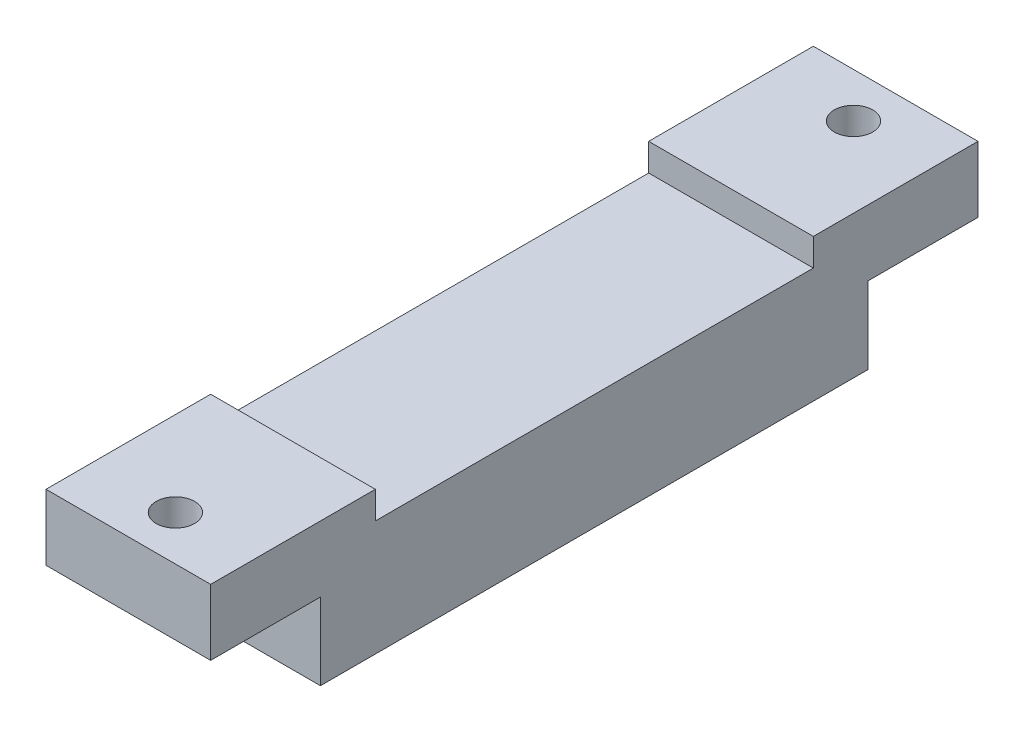
ISO-10303-21;
HEADER;
FILE_DESCRIPTION(('STEP AP214'),'2;1');
FILE_NAME('part.step','',(''),(''),'','','');
FILE_SCHEMA(('AUTOMOTIVE_DESIGN { 1 0 10303 214 1 1 1 1 }'));
ENDSEC;
DATA;
#1=APPLICATION_CONTEXT('core data for automotive mechanical design processes');
#2=APPLICATION_PROTOCOL_DEFINITION('international standard','automotive_design',2000,#1);
#3=PRODUCT_CONTEXT('',#1,'mechanical');
#4=PRODUCT('Part','Part','',(#3));
#5=PRODUCT_RELATED_PRODUCT_CATEGORY('part','',(#4));
#6=PRODUCT_DEFINITION_FORMATION('','',#4);
#7=PRODUCT_DEFINITION_CONTEXT('part definition',#1,'design');
#8=PRODUCT_DEFINITION('design','',#6,#7);
#9=PRODUCT_DEFINITION_SHAPE('','',#8);
#10=(LENGTH_UNIT() NAMED_UNIT(*) SI_UNIT(.MILLI.,.METRE.));
#11=(NAMED_UNIT(*) PLANE_ANGLE_UNIT() SI_UNIT($,.RADIAN.));
#12=(NAMED_UNIT(*) SI_UNIT($,.STERADIAN.) SOLID_ANGLE_UNIT());
#13=UNCERTAINTY_MEASURE_WITH_UNIT(LENGTH_MEASURE(1.E-05),#10,'distance_accuracy_value','');
#14=(GEOMETRIC_REPRESENTATION_CONTEXT(3) GLOBAL_UNCERTAINTY_ASSIGNED_CONTEXT((#13)) GLOBAL_UNIT_ASSIGNED_CONTEXT((#10,
#11,#12)) REPRESENTATION_CONTEXT('',''));
#15=CARTESIAN_POINT('',(0.,0.,0.));
#16=DIRECTION('',(0.,0.,1.));
#17=DIRECTION('',(1.,0.,0.));
#18=AXIS2_PLACEMENT_3D('',#15,#16,#17);
#19=CARTESIAN_POINT('',(0.,13.,0.));
#20=DIRECTION('',(0.,-1.,0.));
#21=DIRECTION('',(0.,0.,-1.));
#22=AXIS2_PLACEMENT_3D('',#19,#20,#21);
#23=PLANE('',#22);
#24=CARTESIAN_POINT('',(7.72256481687533,13.,-30.8856889982669));
#25=DIRECTION('',(0.,1.,0.));
#26=DIRECTION('',(0.,0.,1.));
#27=AXIS2_PLACEMENT_3D('',#24,#25,#26);
#28=CIRCLE('',#27,1.75);
#29=CARTESIAN_POINT('',(7.72256481687533,13.,-29.1356889982669));
#30=VERTEX_POINT('',#29);
#31=EDGE_CURVE('E197',#30,#30,#28,.T.);
#32=ORIENTED_EDGE('',*,*,#31,.F.);
#33=EDGE_LOOP('',(#32));
#34=FACE_BOUND('',#33,.T.);
#35=DIRECTION('',(0.,0.,1.));
#36=VECTOR('',#35,1.);
#37=CARTESIAN_POINT('',(0.,13.,24.95));
#38=LINE('',#37,#36);
#39=CARTESIAN_POINT('',(0.,13.,-34.95));
#40=VERTEX_POINT('',#39);
#41=CARTESIAN_POINT('',(0.,13.,-19.95));
#42=VERTEX_POINT('',#41);
#43=EDGE_CURVE('E171',#40,#42,#38,.T.);
#44=ORIENTED_EDGE('',*,*,#43,.T.);
#45=DIRECTION('',(-1.,0.,0.));
#46=VECTOR('',#45,1.);
#47=CARTESIAN_POINT('',(0.,13.,-19.95));
#48=LINE('',#47,#46);
#49=CARTESIAN_POINT('',(15.,13.,-19.95));
#50=VERTEX_POINT('',#49);
#51=EDGE_CURVE('E227',#50,#42,#48,.T.);
#52=ORIENTED_EDGE('',*,*,#51,.F.);
#53=DIRECTION('',(0.,0.,-1.));
#54=VECTOR('',#53,1.);
#55=CARTESIAN_POINT('',(15.,13.,24.95));
#56=LINE('',#55,#54);
#57=CARTESIAN_POINT('',(15.,13.,-34.95));
#58=VERTEX_POINT('',#57);
#59=EDGE_CURVE('E174',#50,#58,#56,.T.);
#60=ORIENTED_EDGE('',*,*,#59,.T.);
#61=DIRECTION('',(1.,0.,0.));
#62=VECTOR('',#61,1.);
#63=CARTESIAN_POINT('',(15.,13.,-34.95));
#64=LINE('',#63,#62);
#65=EDGE_CURVE('E162',#40,#58,#64,.T.);
#66=ORIENTED_EDGE('',*,*,#65,.F.);
#67=EDGE_LOOP('',(#44,#52,#60,#66));
#68=FACE_BOUND('',#67,.T.);
#69=ADVANCED_FACE('F45',(#34,#68),#23,.F.);
#70=CARTESIAN_POINT('',(0.,2.,-24.95));
#71=DIRECTION('',(0.,0.,1.));
#72=DIRECTION('',(1.,0.,0.));
#73=AXIS2_PLACEMENT_3D('',#70,#71,#72);
#74=PLANE('',#73);
#75=DIRECTION('',(0.,-1.,0.));
#76=VECTOR('',#75,1.);
#77=CARTESIAN_POINT('',(0.,2.,-24.95));
#78=LINE('',#77,#76);
#79=CARTESIAN_POINT('',(0.,7.,-24.95));
#80=VERTEX_POINT('',#79);
#81=CARTESIAN_POINT('',(0.,0.,-24.95));
#82=VERTEX_POINT('',#81);
#83=EDGE_CURVE('E135',#80,#82,#78,.T.);
#84=ORIENTED_EDGE('',*,*,#83,.F.);
#85=DIRECTION('',(-1.,0.,0.));
#86=VECTOR('',#85,1.);
#87=CARTESIAN_POINT('',(15.,7.,-24.95));
#88=LINE('',#87,#86);
#89=CARTESIAN_POINT('',(15.,7.,-24.95));
#90=VERTEX_POINT('',#89);
#91=EDGE_CURVE('E71',#90,#80,#88,.T.);
#92=ORIENTED_EDGE('',*,*,#91,.F.);
#93=DIRECTION('',(0.,-1.,0.));
#94=VECTOR('',#93,1.);
#95=CARTESIAN_POINT('',(15.,2.,-24.95));
#96=LINE('',#95,#94);
#97=CARTESIAN_POINT('',(15.,0.,-24.95));
#98=VERTEX_POINT('',#97);
#99=EDGE_CURVE('E144',#90,#98,#96,.T.);
#100=ORIENTED_EDGE('',*,*,#99,.T.);
#101=DIRECTION('',(-1.,0.,0.));
#102=VECTOR('',#101,1.);
#103=CARTESIAN_POINT('',(0.,0.,-24.95));
#104=LINE('',#103,#102);
#105=EDGE_CURVE('E138',#98,#82,#104,.T.);
#106=ORIENTED_EDGE('',*,*,#105,.T.);
#107=EDGE_LOOP('',(#84,#92,#100,#106));
#108=FACE_BOUND('',#107,.T.);
#109=ADVANCED_FACE('F136',(#108),#74,.F.);
#110=CARTESIAN_POINT('',(0.,2.,24.95));
#111=DIRECTION('',(1.,0.,0.));
#112=DIRECTION('',(0.,0.,-1.));
#113=AXIS2_PLACEMENT_3D('',#110,#111,#112);
#114=PLANE('',#113);
#115=DIRECTION('',(0.,1.,0.));
#116=VECTOR('',#115,1.);
#117=CARTESIAN_POINT('',(0.,10.5,-19.95));
#118=LINE('',#117,#116);
#119=CARTESIAN_POINT('',(0.,10.5,-19.95));
#120=VERTEX_POINT('',#119);
#121=EDGE_CURVE('E342',#120,#42,#118,.T.);
#122=ORIENTED_EDGE('',*,*,#121,.T.);
#123=ORIENTED_EDGE('',*,*,#43,.F.);
#124=DIRECTION('',(0.,1.,0.));
#125=VECTOR('',#124,1.);
#126=CARTESIAN_POINT('',(0.,13.,-34.95));
#127=LINE('',#126,#125);
#128=CARTESIAN_POINT('',(0.,7.,-34.95));
#129=VERTEX_POINT('',#128);
#130=EDGE_CURVE('E160',#129,#40,#127,.T.);
#131=ORIENTED_EDGE('',*,*,#130,.F.);
#132=DIRECTION('',(0.,0.,1.));
#133=VECTOR('',#132,1.);
#134=CARTESIAN_POINT('',(0.,7.,-34.95));
#135=LINE('',#134,#133);
#136=EDGE_CURVE('E150',#129,#80,#135,.T.);
#137=ORIENTED_EDGE('',*,*,#136,.T.);
#138=ORIENTED_EDGE('',*,*,#83,.T.);
#139=DIRECTION('',(0.,0.,1.));
#140=VECTOR('',#139,1.);
#141=CARTESIAN_POINT('',(0.,0.,24.95));
#142=LINE('',#141,#140);
#143=CARTESIAN_POINT('',(0.,0.,24.95));
#144=VERTEX_POINT('',#143);
#145=EDGE_CURVE('E179',#82,#144,#142,.T.);
#146=ORIENTED_EDGE('',*,*,#145,.T.);
#147=DIRECTION('',(0.,-1.,0.));
#148=VECTOR('',#147,1.);
#149=CARTESIAN_POINT('',(0.,2.,24.95));
#150=LINE('',#149,#148);
#151=CARTESIAN_POINT('',(0.,7.,24.95));
#152=VERTEX_POINT('',#151);
#153=EDGE_CURVE('E11',#152,#144,#150,.T.);
#154=ORIENTED_EDGE('',*,*,#153,.F.);
#155=DIRECTION('',(0.,0.,-1.));
#156=VECTOR('',#155,1.);
#157=CARTESIAN_POINT('',(0.,7.,34.95));
#158=LINE('',#157,#156);
#159=CARTESIAN_POINT('',(0.,7.,34.95));
#160=VERTEX_POINT('',#159);
#161=EDGE_CURVE('E202',#160,#152,#158,.T.);
#162=ORIENTED_EDGE('',*,*,#161,.F.);
#163=DIRECTION('',(0.,1.,0.));
#164=VECTOR('',#163,1.);
#165=CARTESIAN_POINT('',(0.,13.,34.95));
#166=LINE('',#165,#164);
#167=CARTESIAN_POINT('',(0.,13.,34.95));
#168=VERTEX_POINT('',#167);
#169=EDGE_CURVE('E245',#160,#168,#166,.T.);
#170=ORIENTED_EDGE('',*,*,#169,.T.);
#171=CARTESIAN_POINT('',(0.,13.,19.95));
#172=VERTEX_POINT('',#171);
#173=EDGE_CURVE('E166',#172,#168,#38,.T.);
#174=ORIENTED_EDGE('',*,*,#173,.F.);
#175=DIRECTION('',(0.,1.,0.));
#176=VECTOR('',#175,1.);
#177=CARTESIAN_POINT('',(0.,10.5,19.95));
#178=LINE('',#177,#176);
#179=CARTESIAN_POINT('',(0.,10.5,19.95));
#180=VERTEX_POINT('',#179);
#181=EDGE_CURVE('E63',#180,#172,#178,.T.);
#182=ORIENTED_EDGE('',*,*,#181,.F.);
#183=DIRECTION('',(0.,0.,1.));
#184=VECTOR('',#183,1.);
#185=CARTESIAN_POINT('',(0.,10.5,-19.95));
#186=LINE('',#185,#184);
#187=EDGE_CURVE('E320',#120,#180,#186,.T.);
#188=ORIENTED_EDGE('',*,*,#187,.F.);
#189=EDGE_LOOP('',(#122,#123,#131,#137,#138,#146,#154,#162,#170,#174,#182,#188));
#190=FACE_BOUND('',#189,.T.);
#191=ADVANCED_FACE('F47',(#190),#114,.F.);
#192=CARTESIAN_POINT('',(0.,2.,24.95));
#193=DIRECTION('',(0.,0.,-1.));
#194=DIRECTION('',(-1.,0.,0.));
#195=AXIS2_PLACEMENT_3D('',#192,#193,#194);
#196=PLANE('',#195);
#197=DIRECTION('',(-1.,0.,0.));
#198=VECTOR('',#197,1.);
#199=CARTESIAN_POINT('',(15.,7.,24.95));
#200=LINE('',#199,#198);
#201=CARTESIAN_POINT('',(15.,7.,24.95));
#202=VERTEX_POINT('',#201);
#203=EDGE_CURVE('E258',#202,#152,#200,.T.);
#204=ORIENTED_EDGE('',*,*,#203,.T.);
#205=ORIENTED_EDGE('',*,*,#153,.T.);
#206=DIRECTION('',(1.,0.,0.));
#207=VECTOR('',#206,1.);
#208=CARTESIAN_POINT('',(0.,0.,24.95));
#209=LINE('',#208,#207);
#210=CARTESIAN_POINT('',(15.,0.,24.95));
#211=VERTEX_POINT('',#210);
#212=EDGE_CURVE('E182',#144,#211,#209,.T.);
#213=ORIENTED_EDGE('',*,*,#212,.T.);
#214=DIRECTION('',(0.,-1.,0.));
#215=VECTOR('',#214,1.);
#216=CARTESIAN_POINT('',(15.,2.,24.95));
#217=LINE('',#216,#215);
#218=EDGE_CURVE('E55',#202,#211,#217,.T.);
#219=ORIENTED_EDGE('',*,*,#218,.F.);
#220=EDGE_LOOP('',(#204,#205,#213,#219));
#221=FACE_BOUND('',#220,.T.);
#222=ADVANCED_FACE('F268',(#221),#196,.F.);
#223=CARTESIAN_POINT('',(15.,2.,24.95));
#224=DIRECTION('',(-1.,0.,0.));
#225=DIRECTION('',(0.,0.,1.));
#226=AXIS2_PLACEMENT_3D('',#223,#224,#225);
#227=PLANE('',#226);
#228=ORIENTED_EDGE('',*,*,#59,.F.);
#229=DIRECTION('',(0.,1.,0.));
#230=VECTOR('',#229,1.);
#231=CARTESIAN_POINT('',(15.,10.5,-19.95));
#232=LINE('',#231,#230);
#233=CARTESIAN_POINT('',(15.,10.5,-19.95));
#234=VERTEX_POINT('',#233);
#235=EDGE_CURVE('E333',#234,#50,#232,.T.);
#236=ORIENTED_EDGE('',*,*,#235,.F.);
#237=DIRECTION('',(0.,0.,-1.));
#238=VECTOR('',#237,1.);
#239=CARTESIAN_POINT('',(15.,10.5,-19.95));
#240=LINE('',#239,#238);
#241=CARTESIAN_POINT('',(15.,10.5,19.95));
#242=VERTEX_POINT('',#241);
#243=EDGE_CURVE('E335',#242,#234,#240,.T.);
#244=ORIENTED_EDGE('',*,*,#243,.F.);
#245=DIRECTION('',(0.,1.,0.));
#246=VECTOR('',#245,1.);
#247=CARTESIAN_POINT('',(15.,10.5,19.95));
#248=LINE('',#247,#246);
#249=CARTESIAN_POINT('',(15.,13.,19.95));
#250=VERTEX_POINT('',#249);
#251=EDGE_CURVE('E328',#242,#250,#248,.T.);
#252=ORIENTED_EDGE('',*,*,#251,.T.);
#253=CARTESIAN_POINT('',(15.,13.,34.95));
#254=VERTEX_POINT('',#253);
#255=EDGE_CURVE('E175',#254,#250,#56,.T.);
#256=ORIENTED_EDGE('',*,*,#255,.F.);
#257=DIRECTION('',(0.,-1.,0.));
#258=VECTOR('',#257,1.);
#259=CARTESIAN_POINT('',(15.,13.,34.95));
#260=LINE('',#259,#258);
#261=CARTESIAN_POINT('',(15.,7.,34.95));
#262=VERTEX_POINT('',#261);
#263=EDGE_CURVE('E248',#254,#262,#260,.T.);
#264=ORIENTED_EDGE('',*,*,#263,.T.);
#265=DIRECTION('',(0.,0.,-1.));
#266=VECTOR('',#265,1.);
#267=CARTESIAN_POINT('',(15.,7.,34.95));
#268=LINE('',#267,#266);
#269=EDGE_CURVE('E208',#262,#202,#268,.T.);
#270=ORIENTED_EDGE('',*,*,#269,.T.);
#271=ORIENTED_EDGE('',*,*,#218,.T.);
#272=DIRECTION('',(0.,0.,-1.));
#273=VECTOR('',#272,1.);
#274=CARTESIAN_POINT('',(15.,0.,24.95));
#275=LINE('',#274,#273);
#276=EDGE_CURVE('E186',#211,#98,#275,.T.);
#277=ORIENTED_EDGE('',*,*,#276,.T.);
#278=ORIENTED_EDGE('',*,*,#99,.F.);
#279=DIRECTION('',(0.,0.,1.));
#280=VECTOR('',#279,1.);
#281=CARTESIAN_POINT('',(15.,7.,-34.95));
#282=LINE('',#281,#280);
#283=CARTESIAN_POINT('',(15.,7.,-34.95));
#284=VERTEX_POINT('',#283);
#285=EDGE_CURVE('E153',#284,#90,#282,.T.);
#286=ORIENTED_EDGE('',*,*,#285,.F.);
#287=DIRECTION('',(0.,-1.,0.));
#288=VECTOR('',#287,1.);
#289=CARTESIAN_POINT('',(15.,13.,-34.95));
#290=LINE('',#289,#288);
#291=EDGE_CURVE('E155',#58,#284,#290,.T.);
#292=ORIENTED_EDGE('',*,*,#291,.F.);
#293=EDGE_LOOP('',(#228,#236,#244,#252,#256,#264,#270,#271,#277,#278,#286,#292));
#294=FACE_BOUND('',#293,.T.);
#295=ADVANCED_FACE('F263',(#294),#227,.F.);
#296=CARTESIAN_POINT('',(0.,0.,0.));
#297=DIRECTION('',(0.,-1.,0.));
#298=DIRECTION('',(0.,0.,-1.));
#299=AXIS2_PLACEMENT_3D('',#296,#297,#298);
#300=PLANE('',#299);
#301=ORIENTED_EDGE('',*,*,#145,.F.);
#302=ORIENTED_EDGE('',*,*,#105,.F.);
#303=ORIENTED_EDGE('',*,*,#276,.F.);
#304=ORIENTED_EDGE('',*,*,#212,.F.);
#305=EDGE_LOOP('',(#301,#302,#303,#304));
#306=FACE_BOUND('',#305,.T.);
#307=ADVANCED_FACE('F271',(#306),#300,.T.);
#308=CARTESIAN_POINT('',(7.72256481687533,13.,30.8856889982669));
#309=DIRECTION('',(0.,-1.,0.));
#310=DIRECTION('',(0.,0.,-1.));
#311=AXIS2_PLACEMENT_3D('',#308,#309,#310);
#312=CIRCLE('',#311,1.75);
#313=CARTESIAN_POINT('',(7.72256481687533,13.,29.1356889982669));
#314=VERTEX_POINT('',#313);
#315=EDGE_CURVE('E339',#314,#314,#312,.T.);
#316=ORIENTED_EDGE('',*,*,#315,.T.);
#317=EDGE_LOOP('',(#316));
#318=FACE_BOUND('',#317,.T.);
#319=ORIENTED_EDGE('',*,*,#255,.T.);
#320=DIRECTION('',(1.,0.,0.));
#321=VECTOR('',#320,1.);
#322=CARTESIAN_POINT('',(0.,13.,19.95));
#323=LINE('',#322,#321);
#324=EDGE_CURVE('E238',#172,#250,#323,.T.);
#325=ORIENTED_EDGE('',*,*,#324,.F.);
#326=ORIENTED_EDGE('',*,*,#173,.T.);
#327=DIRECTION('',(1.,0.,0.));
#328=VECTOR('',#327,1.);
#329=CARTESIAN_POINT('',(15.,13.,34.95));
#330=LINE('',#329,#328);
#331=EDGE_CURVE('E237',#168,#254,#330,.T.);
#332=ORIENTED_EDGE('',*,*,#331,.T.);
#333=EDGE_LOOP('',(#319,#325,#326,#332));
#334=FACE_BOUND('',#333,.T.);
#335=ADVANCED_FACE('F236',(#318,#334),#23,.F.);
#336=CARTESIAN_POINT('',(15.,7.,-34.95));
#337=DIRECTION('',(0.,1.,0.));
#338=DIRECTION('',(0.,0.,1.));
#339=AXIS2_PLACEMENT_3D('',#336,#337,#338);
#340=PLANE('',#339);
#341=CARTESIAN_POINT('',(7.72256481687533,7.,-30.8856889982669));
#342=DIRECTION('',(0.,1.,0.));
#343=DIRECTION('',(0.,0.,1.));
#344=AXIS2_PLACEMENT_3D('',#341,#342,#343);
#345=CIRCLE('',#344,1.75);
#346=CARTESIAN_POINT('',(7.72256481687533,7.,-29.1356889982669));
#347=VERTEX_POINT('',#346);
#348=EDGE_CURVE('E156',#347,#347,#345,.T.);
#349=ORIENTED_EDGE('',*,*,#348,.T.);
#350=EDGE_LOOP('',(#349));
#351=FACE_BOUND('',#350,.T.);
#352=ORIENTED_EDGE('',*,*,#91,.T.);
#353=ORIENTED_EDGE('',*,*,#136,.F.);
#354=DIRECTION('',(-1.,0.,0.));
#355=VECTOR('',#354,1.);
#356=CARTESIAN_POINT('',(15.,7.,-34.95));
#357=LINE('',#356,#355);
#358=EDGE_CURVE('E215',#284,#129,#357,.T.);
#359=ORIENTED_EDGE('',*,*,#358,.F.);
#360=ORIENTED_EDGE('',*,*,#285,.T.);
#361=EDGE_LOOP('',(#352,#353,#359,#360));
#362=FACE_BOUND('',#361,.T.);
#363=ADVANCED_FACE('F149',(#351,#362),#340,.F.);
#364=CARTESIAN_POINT('',(0.,0.,-34.95));
#365=DIRECTION('',(0.,0.,-1.));
#366=DIRECTION('',(-1.,0.,0.));
#367=AXIS2_PLACEMENT_3D('',#364,#365,#366);
#368=PLANE('',#367);
#369=ORIENTED_EDGE('',*,*,#291,.T.);
#370=ORIENTED_EDGE('',*,*,#358,.T.);
#371=ORIENTED_EDGE('',*,*,#130,.T.);
#372=ORIENTED_EDGE('',*,*,#65,.T.);
#373=EDGE_LOOP('',(#369,#370,#371,#372));
#374=FACE_BOUND('',#373,.T.);
#375=ADVANCED_FACE('F221',(#374),#368,.T.);
#376=CARTESIAN_POINT('',(7.72256481687533,0.,-30.8856889982669));
#377=DIRECTION('',(0.,1.,0.));
#378=DIRECTION('',(0.,0.,1.));
#379=AXIS2_PLACEMENT_3D('',#376,#377,#378);
#380=CYLINDRICAL_SURFACE('',#379,1.75);
#381=ORIENTED_EDGE('',*,*,#31,.T.);
#382=EDGE_LOOP('',(#381));
#383=FACE_BOUND('',#382,.T.);
#384=ORIENTED_EDGE('',*,*,#348,.F.);
#385=EDGE_LOOP('',(#384));
#386=FACE_BOUND('',#385,.T.);
#387=ADVANCED_FACE('F293',(#383,#386),#380,.F.);
#388=CARTESIAN_POINT('',(15.,7.,34.95));
#389=DIRECTION('',(0.,-1.,0.));
#390=DIRECTION('',(0.,0.,-1.));
#391=AXIS2_PLACEMENT_3D('',#388,#389,#390);
#392=PLANE('',#391);
#393=CARTESIAN_POINT('',(7.72256481687533,7.,30.8856889982669));
#394=DIRECTION('',(0.,-1.,0.));
#395=DIRECTION('',(0.,0.,-1.));
#396=AXIS2_PLACEMENT_3D('',#393,#394,#395);
#397=CIRCLE('',#396,1.75);
#398=CARTESIAN_POINT('',(7.72256481687533,7.,29.1356889982669));
#399=VERTEX_POINT('',#398);
#400=EDGE_CURVE('E49',#399,#399,#397,.F.);
#401=ORIENTED_EDGE('',*,*,#400,.T.);
#402=EDGE_LOOP('',(#401));
#403=FACE_BOUND('',#402,.T.);
#404=ORIENTED_EDGE('',*,*,#203,.F.);
#405=ORIENTED_EDGE('',*,*,#269,.F.);
#406=DIRECTION('',(-1.,0.,0.));
#407=VECTOR('',#406,1.);
#408=CARTESIAN_POINT('',(15.,7.,34.95));
#409=LINE('',#408,#407);
#410=EDGE_CURVE('E252',#262,#160,#409,.T.);
#411=ORIENTED_EDGE('',*,*,#410,.T.);
#412=ORIENTED_EDGE('',*,*,#161,.T.);
#413=EDGE_LOOP('',(#404,#405,#411,#412));
#414=FACE_BOUND('',#413,.T.);
#415=ADVANCED_FACE('F266',(#403,#414),#392,.T.);
#416=CARTESIAN_POINT('',(0.,0.,34.95));
#417=DIRECTION('',(0.,0.,1.));
#418=DIRECTION('',(-1.,0.,0.));
#419=AXIS2_PLACEMENT_3D('',#416,#417,#418);
#420=PLANE('',#419);
#421=ORIENTED_EDGE('',*,*,#263,.F.);
#422=ORIENTED_EDGE('',*,*,#331,.F.);
#423=ORIENTED_EDGE('',*,*,#169,.F.);
#424=ORIENTED_EDGE('',*,*,#410,.F.);
#425=EDGE_LOOP('',(#421,#422,#423,#424));
#426=FACE_BOUND('',#425,.T.);
#427=ADVANCED_FACE('F243',(#426),#420,.T.);
#428=CARTESIAN_POINT('',(7.72256481687533,0.,30.8856889982669));
#429=DIRECTION('',(0.,1.,0.));
#430=DIRECTION('',(0.,0.,1.));
#431=AXIS2_PLACEMENT_3D('',#428,#429,#430);
#432=CYLINDRICAL_SURFACE('',#431,1.75);
#433=ORIENTED_EDGE('',*,*,#400,.F.);
#434=EDGE_LOOP('',(#433));
#435=FACE_BOUND('',#434,.T.);
#436=ORIENTED_EDGE('',*,*,#315,.F.);
#437=EDGE_LOOP('',(#436));
#438=FACE_BOUND('',#437,.T.);
#439=ADVANCED_FACE('F301',(#435,#438),#432,.F.);
#440=CARTESIAN_POINT('',(0.,10.5,-19.95));
#441=DIRECTION('',(0.,0.,-1.));
#442=DIRECTION('',(-1.,0.,0.));
#443=AXIS2_PLACEMENT_3D('',#440,#441,#442);
#444=PLANE('',#443);
#445=ORIENTED_EDGE('',*,*,#51,.T.);
#446=ORIENTED_EDGE('',*,*,#121,.F.);
#447=DIRECTION('',(-1.,0.,0.));
#448=VECTOR('',#447,1.);
#449=CARTESIAN_POINT('',(0.,10.5,-19.95));
#450=LINE('',#449,#448);
#451=EDGE_CURVE('E324',#234,#120,#450,.T.);
#452=ORIENTED_EDGE('',*,*,#451,.F.);
#453=ORIENTED_EDGE('',*,*,#235,.T.);
#454=EDGE_LOOP('',(#445,#446,#452,#453));
#455=FACE_BOUND('',#454,.T.);
#456=ADVANCED_FACE('F304',(#455),#444,.F.);
#457=CARTESIAN_POINT('',(0.,10.5,19.95));
#458=DIRECTION('',(0.,0.,1.));
#459=DIRECTION('',(1.,0.,0.));
#460=AXIS2_PLACEMENT_3D('',#457,#458,#459);
#461=PLANE('',#460);
#462=ORIENTED_EDGE('',*,*,#324,.T.);
#463=ORIENTED_EDGE('',*,*,#251,.F.);
#464=DIRECTION('',(1.,0.,0.));
#465=VECTOR('',#464,1.);
#466=CARTESIAN_POINT('',(0.,10.5,19.95));
#467=LINE('',#466,#465);
#468=EDGE_CURVE('E321',#180,#242,#467,.T.);
#469=ORIENTED_EDGE('',*,*,#468,.F.);
#470=ORIENTED_EDGE('',*,*,#181,.T.);
#471=EDGE_LOOP('',(#462,#463,#469,#470));
#472=FACE_BOUND('',#471,.T.);
#473=ADVANCED_FACE('F306',(#472),#461,.F.);
#474=CARTESIAN_POINT('',(0.,10.5,0.));
#475=DIRECTION('',(0.,1.,0.));
#476=DIRECTION('',(0.,0.,1.));
#477=AXIS2_PLACEMENT_3D('',#474,#475,#476);
#478=PLANE('',#477);
#479=ORIENTED_EDGE('',*,*,#187,.T.);
#480=ORIENTED_EDGE('',*,*,#468,.T.);
#481=ORIENTED_EDGE('',*,*,#243,.T.);
#482=ORIENTED_EDGE('',*,*,#451,.T.);
#483=EDGE_LOOP('',(#479,#480,#481,#482));
#484=FACE_BOUND('',#483,.T.);
#485=ADVANCED_FACE('F309',(#484),#478,.T.);
#486=CLOSED_SHELL('',(#69,#109,#191,#222,#295,#307,#335,#363,#375,#387,#415,#427,#439,#456,#473,#485));
#487=MANIFOLD_SOLID_BREP('B2',#486);
#488=ADVANCED_BREP_SHAPE_REPRESENTATION('',(#18,#487),#14);
#489=SHAPE_DEFINITION_REPRESENTATION(#9,#488);
ENDSEC;
END-ISO-10303-21;
